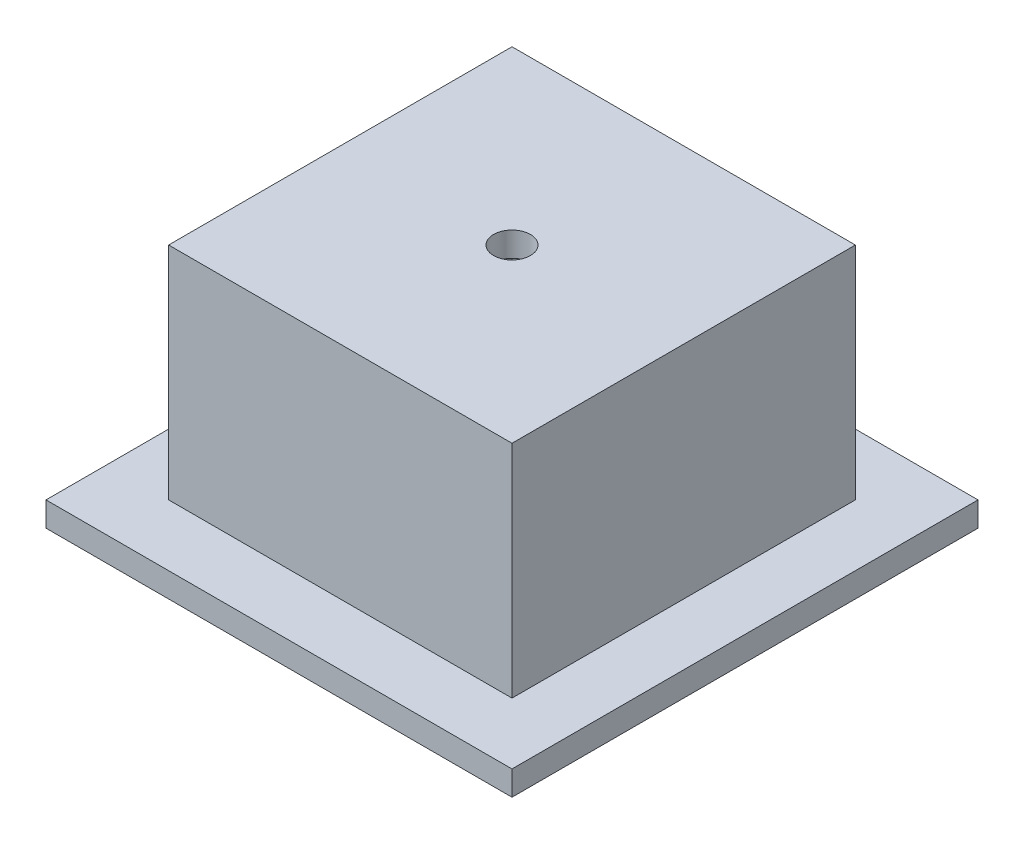
ISO-10303-21;
HEADER;
FILE_DESCRIPTION(('STEP AP214'),'2;1');
FILE_NAME('part.step','',(''),(''),'','','');
FILE_SCHEMA(('AUTOMOTIVE_DESIGN { 1 0 10303 214 1 1 1 1 }'));
ENDSEC;
DATA;
#1=APPLICATION_CONTEXT('core data for automotive mechanical design processes');
#2=APPLICATION_PROTOCOL_DEFINITION('international standard','automotive_design',2000,#1);
#3=PRODUCT_CONTEXT('',#1,'mechanical');
#4=PRODUCT('Part','Part','',(#3));
#5=PRODUCT_RELATED_PRODUCT_CATEGORY('part','',(#4));
#6=PRODUCT_DEFINITION_FORMATION('','',#4);
#7=PRODUCT_DEFINITION_CONTEXT('part definition',#1,'design');
#8=PRODUCT_DEFINITION('design','',#6,#7);
#9=PRODUCT_DEFINITION_SHAPE('','',#8);
#10=(LENGTH_UNIT() NAMED_UNIT(*) SI_UNIT(.MILLI.,.METRE.));
#11=(NAMED_UNIT(*) PLANE_ANGLE_UNIT() SI_UNIT($,.RADIAN.));
#12=(NAMED_UNIT(*) SI_UNIT($,.STERADIAN.) SOLID_ANGLE_UNIT());
#13=UNCERTAINTY_MEASURE_WITH_UNIT(LENGTH_MEASURE(1.E-05),#10,'distance_accuracy_value','');
#14=(GEOMETRIC_REPRESENTATION_CONTEXT(3) GLOBAL_UNCERTAINTY_ASSIGNED_CONTEXT((#13)) GLOBAL_UNIT_ASSIGNED_CONTEXT((#10,
#11,#12)) REPRESENTATION_CONTEXT('',''));
#15=CARTESIAN_POINT('',(0.,0.,0.));
#16=DIRECTION('',(0.,0.,1.));
#17=DIRECTION('',(1.,0.,0.));
#18=AXIS2_PLACEMENT_3D('',#15,#16,#17);
#19=CARTESIAN_POINT('',(35.56,50.7999999999984,-35.5599999999977));
#20=DIRECTION('',(-1.,0.,0.));
#21=DIRECTION('',(0.,0.,1.));
#22=AXIS2_PLACEMENT_3D('',#19,#20,#21);
#23=PLANE('',#22);
#24=DIRECTION('',(0.,-1.,0.));
#25=VECTOR('',#24,1.);
#26=CARTESIAN_POINT('',(35.56,50.8000000000014,35.5600000000026));
#27=LINE('',#26,#25);
#28=CARTESIAN_POINT('',(35.56,50.8000000000014,35.5600000000026));
#29=VERTEX_POINT('',#28);
#30=CARTESIAN_POINT('',(35.56,5.08000000000174,35.56));
#31=VERTEX_POINT('',#30);
#32=EDGE_CURVE('E208',#29,#31,#27,.T.);
#33=ORIENTED_EDGE('',*,*,#32,.T.);
#34=DIRECTION('',(0.,0.,-1.));
#35=VECTOR('',#34,1.);
#36=CARTESIAN_POINT('',(35.56,5.07999999999833,-35.56));
#37=LINE('',#36,#35);
#38=CARTESIAN_POINT('',(35.56,5.07999999999833,-35.56));
#39=VERTEX_POINT('',#38);
#40=EDGE_CURVE('E59',#31,#39,#37,.T.);
#41=ORIENTED_EDGE('',*,*,#40,.T.);
#42=DIRECTION('',(0.,-1.,0.));
#43=VECTOR('',#42,1.);
#44=CARTESIAN_POINT('',(35.56,50.7999999999984,-35.5599999999977));
#45=LINE('',#44,#43);
#46=CARTESIAN_POINT('',(35.56,50.7999999999984,-35.5599999999977));
#47=VERTEX_POINT('',#46);
#48=EDGE_CURVE('E44',#47,#39,#45,.T.);
#49=ORIENTED_EDGE('',*,*,#48,.F.);
#50=DIRECTION('',(0.,0.,-1.));
#51=VECTOR('',#50,1.);
#52=CARTESIAN_POINT('',(35.56,50.7999999999984,-35.5599999999977));
#53=LINE('',#52,#51);
#54=EDGE_CURVE('E199',#29,#47,#53,.T.);
#55=ORIENTED_EDGE('',*,*,#54,.F.);
#56=EDGE_LOOP('',(#33,#41,#49,#55));
#57=FACE_BOUND('',#56,.T.);
#58=ADVANCED_FACE('F36',(#57),#23,.F.);
#59=CARTESIAN_POINT('',(-35.5599999999999,50.7999999999984,-35.5599999999977));
#60=DIRECTION('',(0.,0.,1.));
#61=DIRECTION('',(1.,0.,0.));
#62=AXIS2_PLACEMENT_3D('',#59,#60,#61);
#63=PLANE('',#62);
#64=ORIENTED_EDGE('',*,*,#48,.T.);
#65=DIRECTION('',(-1.,0.,0.));
#66=VECTOR('',#65,1.);
#67=CARTESIAN_POINT('',(-35.56,5.07999999999827,-35.56));
#68=LINE('',#67,#66);
#69=CARTESIAN_POINT('',(-35.56,5.07999999999827,-35.56));
#70=VERTEX_POINT('',#69);
#71=EDGE_CURVE('E195',#39,#70,#68,.T.);
#72=ORIENTED_EDGE('',*,*,#71,.T.);
#73=DIRECTION('',(0.,-1.,0.));
#74=VECTOR('',#73,1.);
#75=CARTESIAN_POINT('',(-35.5599999999999,50.7999999999984,-35.5599999999977));
#76=LINE('',#75,#74);
#77=CARTESIAN_POINT('',(-35.5599999999999,50.7999999999984,-35.5599999999977));
#78=VERTEX_POINT('',#77);
#79=EDGE_CURVE('E214',#78,#70,#76,.T.);
#80=ORIENTED_EDGE('',*,*,#79,.F.);
#81=DIRECTION('',(-1.,0.,0.));
#82=VECTOR('',#81,1.);
#83=CARTESIAN_POINT('',(-35.5599999999999,50.7999999999984,-35.5599999999977));
#84=LINE('',#83,#82);
#85=EDGE_CURVE('E202',#47,#78,#84,.T.);
#86=ORIENTED_EDGE('',*,*,#85,.F.);
#87=EDGE_LOOP('',(#64,#72,#80,#86));
#88=FACE_BOUND('',#87,.T.);
#89=ADVANCED_FACE('F220',(#88),#63,.F.);
#90=CARTESIAN_POINT('',(-35.5599999999999,50.7999999999984,-35.5599999999977));
#91=DIRECTION('',(1.,0.,0.));
#92=DIRECTION('',(0.,0.,-1.));
#93=AXIS2_PLACEMENT_3D('',#90,#91,#92);
#94=PLANE('',#93);
#95=ORIENTED_EDGE('',*,*,#79,.T.);
#96=DIRECTION('',(0.,0.,1.));
#97=VECTOR('',#96,1.);
#98=CARTESIAN_POINT('',(-35.56,5.07999999999827,-35.56));
#99=LINE('',#98,#97);
#100=CARTESIAN_POINT('',(-35.56,5.08000000000167,35.56));
#101=VERTEX_POINT('',#100);
#102=EDGE_CURVE('E192',#70,#101,#99,.T.);
#103=ORIENTED_EDGE('',*,*,#102,.T.);
#104=DIRECTION('',(0.,-1.,0.));
#105=VECTOR('',#104,1.);
#106=CARTESIAN_POINT('',(-35.5599999999999,50.8000000000014,35.5600000000026));
#107=LINE('',#106,#105);
#108=CARTESIAN_POINT('',(-35.5599999999999,50.8000000000014,35.5600000000026));
#109=VERTEX_POINT('',#108);
#110=EDGE_CURVE('E211',#109,#101,#107,.T.);
#111=ORIENTED_EDGE('',*,*,#110,.F.);
#112=DIRECTION('',(0.,0.,1.));
#113=VECTOR('',#112,1.);
#114=CARTESIAN_POINT('',(-35.5599999999999,50.7999999999984,-35.5599999999977));
#115=LINE('',#114,#113);
#116=EDGE_CURVE('E204',#78,#109,#115,.T.);
#117=ORIENTED_EDGE('',*,*,#116,.F.);
#118=EDGE_LOOP('',(#95,#103,#111,#117));
#119=FACE_BOUND('',#118,.T.);
#120=ADVANCED_FACE('F231',(#119),#94,.F.);
#121=CARTESIAN_POINT('',(-35.5599999999999,50.8000000000014,35.5600000000026));
#122=DIRECTION('',(0.,0.,-1.));
#123=DIRECTION('',(-1.,0.,0.));
#124=AXIS2_PLACEMENT_3D('',#121,#122,#123);
#125=PLANE('',#124);
#126=ORIENTED_EDGE('',*,*,#110,.T.);
#127=DIRECTION('',(1.,0.,0.));
#128=VECTOR('',#127,1.);
#129=CARTESIAN_POINT('',(-35.56,5.08000000000167,35.56));
#130=LINE('',#129,#128);
#131=EDGE_CURVE('E12',#101,#31,#130,.T.);
#132=ORIENTED_EDGE('',*,*,#131,.T.);
#133=ORIENTED_EDGE('',*,*,#32,.F.);
#134=DIRECTION('',(1.,0.,0.));
#135=VECTOR('',#134,1.);
#136=CARTESIAN_POINT('',(-35.5599999999999,50.8000000000014,35.5600000000026));
#137=LINE('',#136,#135);
#138=EDGE_CURVE('E206',#109,#29,#137,.T.);
#139=ORIENTED_EDGE('',*,*,#138,.F.);
#140=EDGE_LOOP('',(#126,#132,#133,#139));
#141=FACE_BOUND('',#140,.T.);
#142=ADVANCED_FACE('F227',(#141),#125,.F.);
#143=CARTESIAN_POINT('',(0.,50.7999999999997,1.99840144432528E-12));
#144=DIRECTION('',(0.,1.,0.));
#145=DIRECTION('',(0.,0.,1.));
#146=AXIS2_PLACEMENT_3D('',#143,#144,#145);
#147=PLANE('',#146);
#148=CARTESIAN_POINT('',(0.,50.7999999999997,1.99840144432528E-12));
#149=DIRECTION('',(0.,1.,0.));
#150=DIRECTION('',(0.,0.,1.));
#151=AXIS2_PLACEMENT_3D('',#148,#149,#150);
#152=CIRCLE('',#151,3.81);
#153=CARTESIAN_POINT('',(0.,50.7999999999999,3.810000000002));
#154=VERTEX_POINT('',#153);
#155=EDGE_CURVE('E311',#154,#154,#152,.T.);
#156=ORIENTED_EDGE('',*,*,#155,.F.);
#157=EDGE_LOOP('',(#156));
#158=FACE_BOUND('',#157,.T.);
#159=ORIENTED_EDGE('',*,*,#54,.T.);
#160=ORIENTED_EDGE('',*,*,#85,.T.);
#161=ORIENTED_EDGE('',*,*,#116,.T.);
#162=ORIENTED_EDGE('',*,*,#138,.T.);
#163=EDGE_LOOP('',(#159,#160,#161,#162));
#164=FACE_BOUND('',#163,.T.);
#165=ADVANCED_FACE('F234',(#158,#164),#147,.T.);
#166=CARTESIAN_POINT('',(0.,5.07999999999999,6.66133814775094E-13));
#167=DIRECTION('',(0.,1.,0.));
#168=DIRECTION('',(0.,0.,1.));
#169=AXIS2_PLACEMENT_3D('',#166,#167,#168);
#170=PLANE('',#169);
#171=DIRECTION('',(0.,0.,-1.));
#172=VECTOR('',#171,1.);
#173=CARTESIAN_POINT('',(48.26,5.07999999999767,-48.26));
#174=LINE('',#173,#172);
#175=CARTESIAN_POINT('',(48.26,5.08000000000233,48.26));
#176=VERTEX_POINT('',#175);
#177=CARTESIAN_POINT('',(48.26,5.07999999999767,-48.26));
#178=VERTEX_POINT('',#177);
#179=EDGE_CURVE('E163',#176,#178,#174,.T.);
#180=ORIENTED_EDGE('',*,*,#179,.T.);
#181=DIRECTION('',(-1.,0.,0.));
#182=VECTOR('',#181,1.);
#183=CARTESIAN_POINT('',(-48.26,5.07999999999767,-48.26));
#184=LINE('',#183,#182);
#185=CARTESIAN_POINT('',(-48.26,5.07999999999767,-48.26));
#186=VERTEX_POINT('',#185);
#187=EDGE_CURVE('E166',#178,#186,#184,.T.);
#188=ORIENTED_EDGE('',*,*,#187,.T.);
#189=DIRECTION('',(0.,0.,1.));
#190=VECTOR('',#189,1.);
#191=CARTESIAN_POINT('',(-48.26,5.07999999999767,-48.26));
#192=LINE('',#191,#190);
#193=CARTESIAN_POINT('',(-48.26,5.08000000000233,48.26));
#194=VERTEX_POINT('',#193);
#195=EDGE_CURVE('E169',#186,#194,#192,.T.);
#196=ORIENTED_EDGE('',*,*,#195,.T.);
#197=DIRECTION('',(1.,0.,0.));
#198=VECTOR('',#197,1.);
#199=CARTESIAN_POINT('',(-48.26,5.08000000000233,48.26));
#200=LINE('',#199,#198);
#201=EDGE_CURVE('E171',#194,#176,#200,.T.);
#202=ORIENTED_EDGE('',*,*,#201,.T.);
#203=EDGE_LOOP('',(#180,#188,#196,#202));
#204=FACE_BOUND('',#203,.T.);
#205=ORIENTED_EDGE('',*,*,#40,.F.);
#206=ORIENTED_EDGE('',*,*,#131,.F.);
#207=ORIENTED_EDGE('',*,*,#102,.F.);
#208=ORIENTED_EDGE('',*,*,#71,.F.);
#209=EDGE_LOOP('',(#205,#206,#207,#208));
#210=FACE_BOUND('',#209,.T.);
#211=ADVANCED_FACE('F229',(#204,#210),#170,.T.);
#212=CARTESIAN_POINT('',(48.26,5.07999999999767,-48.26));
#213=DIRECTION('',(-1.,0.,0.));
#214=DIRECTION('',(0.,0.,1.));
#215=AXIS2_PLACEMENT_3D('',#212,#213,#214);
#216=PLANE('',#215);
#217=DIRECTION('',(0.,0.,-1.));
#218=VECTOR('',#217,1.);
#219=CARTESIAN_POINT('',(48.26,-2.29764124393128E-12,-48.26));
#220=LINE('',#219,#218);
#221=CARTESIAN_POINT('',(48.26,2.31585584042904E-12,48.26));
#222=VERTEX_POINT('',#221);
#223=CARTESIAN_POINT('',(48.26,-2.29764124393128E-12,-48.26));
#224=VERTEX_POINT('',#223);
#225=EDGE_CURVE('E162',#222,#224,#220,.T.);
#226=ORIENTED_EDGE('',*,*,#225,.T.);
#227=DIRECTION('',(0.,-1.,0.));
#228=VECTOR('',#227,1.);
#229=CARTESIAN_POINT('',(48.26,5.07999999999767,-48.26));
#230=LINE('',#229,#228);
#231=EDGE_CURVE('E189',#178,#224,#230,.T.);
#232=ORIENTED_EDGE('',*,*,#231,.F.);
#233=ORIENTED_EDGE('',*,*,#179,.F.);
#234=DIRECTION('',(0.,-1.,0.));
#235=VECTOR('',#234,1.);
#236=CARTESIAN_POINT('',(48.26,5.08000000000233,48.26));
#237=LINE('',#236,#235);
#238=EDGE_CURVE('E173',#176,#222,#237,.T.);
#239=ORIENTED_EDGE('',*,*,#238,.T.);
#240=EDGE_LOOP('',(#226,#232,#233,#239));
#241=FACE_BOUND('',#240,.T.);
#242=ADVANCED_FACE('F242',(#241),#216,.F.);
#243=CARTESIAN_POINT('',(-48.26,5.07999999999767,-48.26));
#244=DIRECTION('',(0.,0.,1.));
#245=DIRECTION('',(1.,0.,0.));
#246=AXIS2_PLACEMENT_3D('',#243,#244,#245);
#247=PLANE('',#246);
#248=DIRECTION('',(-1.,0.,0.));
#249=VECTOR('',#248,1.);
#250=CARTESIAN_POINT('',(-48.26,-2.33146835171283E-12,-48.26));
#251=LINE('',#250,#249);
#252=CARTESIAN_POINT('',(-48.26,-2.33146835171283E-12,-48.26));
#253=VERTEX_POINT('',#252);
#254=EDGE_CURVE('E176',#224,#253,#251,.T.);
#255=ORIENTED_EDGE('',*,*,#254,.T.);
#256=DIRECTION('',(0.,-1.,0.));
#257=VECTOR('',#256,1.);
#258=CARTESIAN_POINT('',(-48.26,5.07999999999767,-48.26));
#259=LINE('',#258,#257);
#260=EDGE_CURVE('E186',#186,#253,#259,.T.);
#261=ORIENTED_EDGE('',*,*,#260,.F.);
#262=ORIENTED_EDGE('',*,*,#187,.F.);
#263=ORIENTED_EDGE('',*,*,#231,.T.);
#264=EDGE_LOOP('',(#255,#261,#262,#263));
#265=FACE_BOUND('',#264,.T.);
#266=ADVANCED_FACE('F284',(#265),#247,.F.);
#267=CARTESIAN_POINT('',(-48.26,5.07999999999767,-48.26));
#268=DIRECTION('',(1.,0.,0.));
#269=DIRECTION('',(0.,0.,-1.));
#270=AXIS2_PLACEMENT_3D('',#267,#268,#269);
#271=PLANE('',#270);
#272=DIRECTION('',(0.,0.,1.));
#273=VECTOR('',#272,1.);
#274=CARTESIAN_POINT('',(-48.26,-2.33146835171283E-12,-48.26));
#275=LINE('',#274,#273);
#276=CARTESIAN_POINT('',(-48.26,2.28202873264749E-12,48.26));
#277=VERTEX_POINT('',#276);
#278=EDGE_CURVE('E178',#253,#277,#275,.T.);
#279=ORIENTED_EDGE('',*,*,#278,.T.);
#280=DIRECTION('',(0.,-1.,0.));
#281=VECTOR('',#280,1.);
#282=CARTESIAN_POINT('',(-48.26,5.08000000000233,48.26));
#283=LINE('',#282,#281);
#284=EDGE_CURVE('E183',#194,#277,#283,.T.);
#285=ORIENTED_EDGE('',*,*,#284,.F.);
#286=ORIENTED_EDGE('',*,*,#195,.F.);
#287=ORIENTED_EDGE('',*,*,#260,.T.);
#288=EDGE_LOOP('',(#279,#285,#286,#287));
#289=FACE_BOUND('',#288,.T.);
#290=ADVANCED_FACE('F267',(#289),#271,.F.);
#291=CARTESIAN_POINT('',(-48.26,5.08000000000233,48.26));
#292=DIRECTION('',(0.,0.,-1.));
#293=DIRECTION('',(-1.,0.,0.));
#294=AXIS2_PLACEMENT_3D('',#291,#292,#293);
#295=PLANE('',#294);
#296=DIRECTION('',(1.,0.,0.));
#297=VECTOR('',#296,1.);
#298=CARTESIAN_POINT('',(-48.26,2.28202873264749E-12,48.26));
#299=LINE('',#298,#297);
#300=EDGE_CURVE('E167',#277,#222,#299,.T.);
#301=ORIENTED_EDGE('',*,*,#300,.T.);
#302=ORIENTED_EDGE('',*,*,#238,.F.);
#303=ORIENTED_EDGE('',*,*,#201,.F.);
#304=ORIENTED_EDGE('',*,*,#284,.T.);
#305=EDGE_LOOP('',(#301,#302,#303,#304));
#306=FACE_BOUND('',#305,.T.);
#307=ADVANCED_FACE('F259',(#306),#295,.F.);
#308=CARTESIAN_POINT('',(0.,0.,0.));
#309=DIRECTION('',(0.,1.,0.));
#310=DIRECTION('',(0.,0.,1.));
#311=AXIS2_PLACEMENT_3D('',#308,#309,#310);
#312=PLANE('',#311);
#313=DIRECTION('',(0.,0.,-1.));
#314=VECTOR('',#313,1.);
#315=CARTESIAN_POINT('',(-32.385,1.5404344466674E-12,32.385));
#316=LINE('',#315,#314);
#317=CARTESIAN_POINT('',(-32.385,1.5404344466674E-12,32.385));
#318=VERTEX_POINT('',#317);
#319=CARTESIAN_POINT('',(-32.385,-1.58206781009085E-12,-32.385));
#320=VERTEX_POINT('',#319);
#321=EDGE_CURVE('E148',#318,#320,#316,.T.);
#322=ORIENTED_EDGE('',*,*,#321,.F.);
#323=DIRECTION('',(-1.,0.,0.));
#324=VECTOR('',#323,1.);
#325=CARTESIAN_POINT('',(-32.385,1.5404344466674E-12,32.385));
#326=LINE('',#325,#324);
#327=CARTESIAN_POINT('',(32.385,1.5404344466674E-12,32.385));
#328=VERTEX_POINT('',#327);
#329=EDGE_CURVE('E141',#328,#318,#326,.T.);
#330=ORIENTED_EDGE('',*,*,#329,.F.);
#331=DIRECTION('',(0.,0.,1.));
#332=VECTOR('',#331,1.);
#333=CARTESIAN_POINT('',(32.385,1.5404344466674E-12,32.385));
#334=LINE('',#333,#332);
#335=CARTESIAN_POINT('',(32.385,-1.58206781009085E-12,-32.385));
#336=VERTEX_POINT('',#335);
#337=EDGE_CURVE('E152',#336,#328,#334,.T.);
#338=ORIENTED_EDGE('',*,*,#337,.F.);
#339=DIRECTION('',(1.,0.,0.));
#340=VECTOR('',#339,1.);
#341=CARTESIAN_POINT('',(-32.385,-1.58206781009085E-12,-32.385));
#342=LINE('',#341,#340);
#343=EDGE_CURVE('E51',#320,#336,#342,.T.);
#344=ORIENTED_EDGE('',*,*,#343,.F.);
#345=EDGE_LOOP('',(#322,#330,#338,#344));
#346=FACE_BOUND('',#345,.T.);
#347=ORIENTED_EDGE('',*,*,#225,.F.);
#348=ORIENTED_EDGE('',*,*,#300,.F.);
#349=ORIENTED_EDGE('',*,*,#278,.F.);
#350=ORIENTED_EDGE('',*,*,#254,.F.);
#351=EDGE_LOOP('',(#347,#348,#349,#350));
#352=FACE_BOUND('',#351,.T.);
#353=ADVANCED_FACE('F257',(#346,#352),#312,.F.);
#354=CARTESIAN_POINT('',(0.,45.7199999999997,1.99840144432528E-12));
#355=DIRECTION('',(0.,1.,0.));
#356=DIRECTION('',(0.,0.,1.));
#357=AXIS2_PLACEMENT_3D('',#354,#355,#356);
#358=PLANE('',#357);
#359=CARTESIAN_POINT('',(0.,45.7199999999997,1.99840144432528E-12));
#360=DIRECTION('',(0.,1.,0.));
#361=DIRECTION('',(0.,0.,1.));
#362=AXIS2_PLACEMENT_3D('',#359,#360,#361);
#363=CIRCLE('',#362,3.81);
#364=CARTESIAN_POINT('',(0.,45.7199999999999,3.810000000002));
#365=VERTEX_POINT('',#364);
#366=EDGE_CURVE('E39',#365,#365,#363,.T.);
#367=ORIENTED_EDGE('',*,*,#366,.T.);
#368=EDGE_LOOP('',(#367));
#369=FACE_BOUND('',#368,.T.);
#370=DIRECTION('',(0.,0.,1.));
#371=VECTOR('',#370,1.);
#372=CARTESIAN_POINT('',(32.385,45.7200000000013,32.385000000002));
#373=LINE('',#372,#371);
#374=CARTESIAN_POINT('',(32.385,45.7199999999983,-32.3849999999977));
#375=VERTEX_POINT('',#374);
#376=CARTESIAN_POINT('',(32.385,45.7200000000013,32.385000000002));
#377=VERTEX_POINT('',#376);
#378=EDGE_CURVE('E145',#375,#377,#373,.T.);
#379=ORIENTED_EDGE('',*,*,#378,.T.);
#380=DIRECTION('',(-1.,0.,0.));
#381=VECTOR('',#380,1.);
#382=CARTESIAN_POINT('',(-32.385,45.7200000000017,32.385000000002));
#383=LINE('',#382,#381);
#384=CARTESIAN_POINT('',(-32.385,45.7200000000017,32.385000000002));
#385=VERTEX_POINT('',#384);
#386=EDGE_CURVE('E138',#377,#385,#383,.T.);
#387=ORIENTED_EDGE('',*,*,#386,.T.);
#388=DIRECTION('',(0.,0.,-1.));
#389=VECTOR('',#388,1.);
#390=CARTESIAN_POINT('',(-32.385,45.7200000000017,32.385000000002));
#391=LINE('',#390,#389);
#392=CARTESIAN_POINT('',(-32.385,45.7199999999987,-32.3849999999977));
#393=VERTEX_POINT('',#392);
#394=EDGE_CURVE('E125',#385,#393,#391,.T.);
#395=ORIENTED_EDGE('',*,*,#394,.T.);
#396=DIRECTION('',(1.,0.,0.));
#397=VECTOR('',#396,1.);
#398=CARTESIAN_POINT('',(-32.385,45.7199999999987,-32.3849999999977));
#399=LINE('',#398,#397);
#400=EDGE_CURVE('E157',#393,#375,#399,.T.);
#401=ORIENTED_EDGE('',*,*,#400,.T.);
#402=EDGE_LOOP('',(#379,#387,#395,#401));
#403=FACE_BOUND('',#402,.T.);
#404=ADVANCED_FACE('F144',(#369,#403),#358,.F.);
#405=CARTESIAN_POINT('',(-32.385,142.398612434906,32.3850000000067));
#406=DIRECTION('',(0.,0.,1.));
#407=DIRECTION('',(1.,0.,0.));
#408=AXIS2_PLACEMENT_3D('',#405,#406,#407);
#409=PLANE('',#408);
#410=DIRECTION('',(0.,-1.,0.));
#411=VECTOR('',#410,1.);
#412=CARTESIAN_POINT('',(32.385,142.398612434908,32.3850000000067));
#413=LINE('',#412,#411);
#414=EDGE_CURVE('E155',#377,#328,#413,.T.);
#415=ORIENTED_EDGE('',*,*,#414,.T.);
#416=ORIENTED_EDGE('',*,*,#329,.T.);
#417=DIRECTION('',(0.,-1.,0.));
#418=VECTOR('',#417,1.);
#419=CARTESIAN_POINT('',(-32.385,142.398612434906,32.3850000000067));
#420=LINE('',#419,#418);
#421=EDGE_CURVE('E129',#385,#318,#420,.T.);
#422=ORIENTED_EDGE('',*,*,#421,.F.);
#423=ORIENTED_EDGE('',*,*,#386,.F.);
#424=EDGE_LOOP('',(#415,#416,#422,#423));
#425=FACE_BOUND('',#424,.T.);
#426=ADVANCED_FACE('F137',(#425),#409,.F.);
#427=CARTESIAN_POINT('',(-32.385,142.398612434906,32.3850000000067));
#428=DIRECTION('',(-1.,0.,0.));
#429=DIRECTION('',(0.,0.,1.));
#430=AXIS2_PLACEMENT_3D('',#427,#428,#429);
#431=PLANE('',#430);
#432=ORIENTED_EDGE('',*,*,#421,.T.);
#433=ORIENTED_EDGE('',*,*,#321,.T.);
#434=DIRECTION('',(0.,-1.,0.));
#435=VECTOR('',#434,1.);
#436=CARTESIAN_POINT('',(-32.385,142.398612434903,-32.3849999999933));
#437=LINE('',#436,#435);
#438=EDGE_CURVE('E131',#393,#320,#437,.T.);
#439=ORIENTED_EDGE('',*,*,#438,.F.);
#440=ORIENTED_EDGE('',*,*,#394,.F.);
#441=EDGE_LOOP('',(#432,#433,#439,#440));
#442=FACE_BOUND('',#441,.T.);
#443=ADVANCED_FACE('F127',(#442),#431,.F.);
#444=CARTESIAN_POINT('',(-32.385,142.398612434903,-32.3849999999933));
#445=DIRECTION('',(0.,0.,-1.));
#446=DIRECTION('',(-1.,0.,0.));
#447=AXIS2_PLACEMENT_3D('',#444,#445,#446);
#448=PLANE('',#447);
#449=ORIENTED_EDGE('',*,*,#438,.T.);
#450=ORIENTED_EDGE('',*,*,#343,.T.);
#451=DIRECTION('',(0.,-1.,0.));
#452=VECTOR('',#451,1.);
#453=CARTESIAN_POINT('',(32.385,142.398612434904,-32.3849999999933));
#454=LINE('',#453,#452);
#455=EDGE_CURVE('E156',#375,#336,#454,.T.);
#456=ORIENTED_EDGE('',*,*,#455,.F.);
#457=ORIENTED_EDGE('',*,*,#400,.F.);
#458=EDGE_LOOP('',(#449,#450,#456,#457));
#459=FACE_BOUND('',#458,.T.);
#460=ADVANCED_FACE('F297',(#459),#448,.F.);
#461=CARTESIAN_POINT('',(32.385,142.398612434908,32.3850000000067));
#462=DIRECTION('',(1.,0.,0.));
#463=DIRECTION('',(0.,0.,-1.));
#464=AXIS2_PLACEMENT_3D('',#461,#462,#463);
#465=PLANE('',#464);
#466=ORIENTED_EDGE('',*,*,#455,.T.);
#467=ORIENTED_EDGE('',*,*,#337,.T.);
#468=ORIENTED_EDGE('',*,*,#414,.F.);
#469=ORIENTED_EDGE('',*,*,#378,.F.);
#470=EDGE_LOOP('',(#466,#467,#468,#469));
#471=FACE_BOUND('',#470,.T.);
#472=ADVANCED_FACE('F300',(#471),#465,.F.);
#473=CARTESIAN_POINT('',(0.,0.,0.));
#474=DIRECTION('',(0.,1.,0.));
#475=DIRECTION('',(0.,0.,1.));
#476=AXIS2_PLACEMENT_3D('',#473,#474,#475);
#477=CYLINDRICAL_SURFACE('',#476,3.81);
#478=ORIENTED_EDGE('',*,*,#155,.T.);
#479=EDGE_LOOP('',(#478));
#480=FACE_BOUND('',#479,.T.);
#481=ORIENTED_EDGE('',*,*,#366,.F.);
#482=EDGE_LOOP('',(#481));
#483=FACE_BOUND('',#482,.T.);
#484=ADVANCED_FACE('F303',(#480,#483),#477,.F.);
#485=CLOSED_SHELL('',(#58,#89,#120,#142,#165,#211,#242,#266,#290,#307,#353,#404,#426,#443,#460,
#472,#484));
#486=MANIFOLD_SOLID_BREP('B2',#485);
#487=ADVANCED_BREP_SHAPE_REPRESENTATION('',(#18,#486),#14);
#488=SHAPE_DEFINITION_REPRESENTATION(#9,#487);
ENDSEC;
END-ISO-10303-21;
